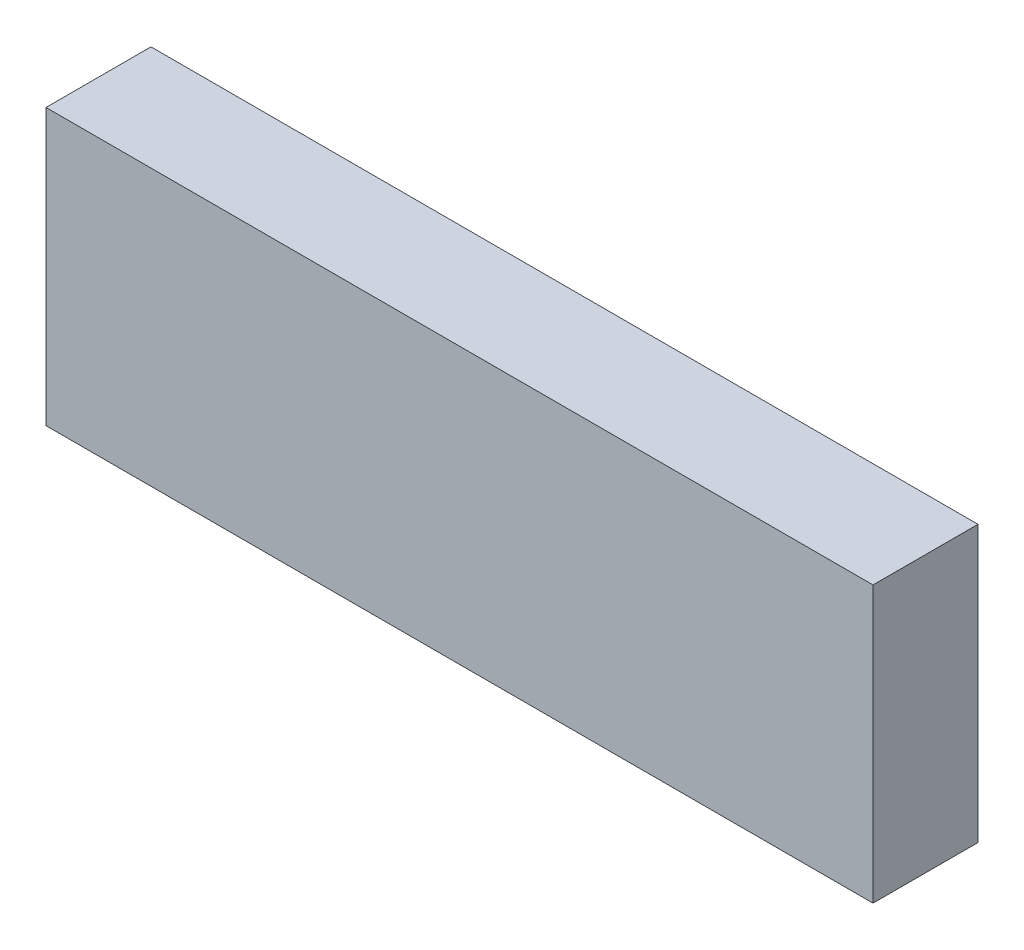
ISO-10303-21;
HEADER;
FILE_DESCRIPTION(('STEP AP214'),'2;1');
FILE_NAME('part.step','',(''),(''),'','','');
FILE_SCHEMA(('AUTOMOTIVE_DESIGN { 1 0 10303 214 1 1 1 1 }'));
ENDSEC;
DATA;
#1=APPLICATION_CONTEXT('core data for automotive mechanical design processes');
#2=APPLICATION_PROTOCOL_DEFINITION('international standard','automotive_design',2000,#1);
#3=PRODUCT_CONTEXT('',#1,'mechanical');
#4=PRODUCT('Part','Part','',(#3));
#5=PRODUCT_RELATED_PRODUCT_CATEGORY('part','',(#4));
#6=PRODUCT_DEFINITION_FORMATION('','',#4);
#7=PRODUCT_DEFINITION_CONTEXT('part definition',#1,'design');
#8=PRODUCT_DEFINITION('design','',#6,#7);
#9=PRODUCT_DEFINITION_SHAPE('','',#8);
#10=(LENGTH_UNIT() NAMED_UNIT(*) SI_UNIT(.MILLI.,.METRE.));
#11=(NAMED_UNIT(*) PLANE_ANGLE_UNIT() SI_UNIT($,.RADIAN.));
#12=(NAMED_UNIT(*) SI_UNIT($,.STERADIAN.) SOLID_ANGLE_UNIT());
#13=UNCERTAINTY_MEASURE_WITH_UNIT(LENGTH_MEASURE(1.E-05),#10,'distance_accuracy_value','');
#14=(GEOMETRIC_REPRESENTATION_CONTEXT(3) GLOBAL_UNCERTAINTY_ASSIGNED_CONTEXT((#13)) GLOBAL_UNIT_ASSIGNED_CONTEXT((#10,
#11,#12)) REPRESENTATION_CONTEXT('',''));
#15=CARTESIAN_POINT('',(0.,0.,0.));
#16=DIRECTION('',(0.,0.,1.));
#17=DIRECTION('',(1.,0.,0.));
#18=AXIS2_PLACEMENT_3D('',#15,#16,#17);
#19=CARTESIAN_POINT('',(0.,30.,0.));
#20=DIRECTION('',(1.,0.,0.));
#21=DIRECTION('',(0.,0.,-1.));
#22=AXIS2_PLACEMENT_3D('',#19,#20,#21);
#23=PLANE('',#22);
#24=DIRECTION('',(0.,0.,1.));
#25=VECTOR('',#24,1.);
#26=CARTESIAN_POINT('',(0.,0.,0.));
#27=LINE('',#26,#25);
#28=CARTESIAN_POINT('',(0.,0.,-11.4283976224775));
#29=VERTEX_POINT('',#28);
#30=CARTESIAN_POINT('',(0.,0.,0.));
#31=VERTEX_POINT('',#30);
#32=EDGE_CURVE('E113',#29,#31,#27,.T.);
#33=ORIENTED_EDGE('',*,*,#32,.T.);
#34=DIRECTION('',(0.,-1.,0.));
#35=VECTOR('',#34,1.);
#36=CARTESIAN_POINT('',(0.,30.,0.));
#37=LINE('',#36,#35);
#38=CARTESIAN_POINT('',(0.,30.,0.));
#39=VERTEX_POINT('',#38);
#40=EDGE_CURVE('E11',#39,#31,#37,.T.);
#41=ORIENTED_EDGE('',*,*,#40,.F.);
#42=DIRECTION('',(0.,0.,1.));
#43=VECTOR('',#42,1.);
#44=CARTESIAN_POINT('',(0.,30.,0.));
#45=LINE('',#44,#43);
#46=CARTESIAN_POINT('',(0.,30.,-11.4283976224775));
#47=VERTEX_POINT('',#46);
#48=EDGE_CURVE('E97',#47,#39,#45,.T.);
#49=ORIENTED_EDGE('',*,*,#48,.F.);
#50=DIRECTION('',(0.,-1.,0.));
#51=VECTOR('',#50,1.);
#52=CARTESIAN_POINT('',(0.,30.,-11.4283976224775));
#53=LINE('',#52,#51);
#54=EDGE_CURVE('E109',#47,#29,#53,.T.);
#55=ORIENTED_EDGE('',*,*,#54,.T.);
#56=EDGE_LOOP('',(#33,#41,#49,#55));
#57=FACE_BOUND('',#56,.T.);
#58=ADVANCED_FACE('F45',(#57),#23,.F.);
#59=CARTESIAN_POINT('',(0.,30.,0.));
#60=DIRECTION('',(0.,0.,-1.));
#61=DIRECTION('',(-1.,0.,0.));
#62=AXIS2_PLACEMENT_3D('',#59,#60,#61);
#63=PLANE('',#62);
#64=DIRECTION('',(1.,0.,0.));
#65=VECTOR('',#64,1.);
#66=CARTESIAN_POINT('',(0.,0.,0.));
#67=LINE('',#66,#65);
#68=CARTESIAN_POINT('',(90.023693552498,0.,0.));
#69=VERTEX_POINT('',#68);
#70=EDGE_CURVE('E102',#31,#69,#67,.T.);
#71=ORIENTED_EDGE('',*,*,#70,.T.);
#72=DIRECTION('',(0.,-1.,0.));
#73=VECTOR('',#72,1.);
#74=CARTESIAN_POINT('',(90.023693552498,30.,0.));
#75=LINE('',#74,#73);
#76=CARTESIAN_POINT('',(90.023693552498,30.,0.));
#77=VERTEX_POINT('',#76);
#78=EDGE_CURVE('E54',#77,#69,#75,.T.);
#79=ORIENTED_EDGE('',*,*,#78,.F.);
#80=DIRECTION('',(1.,0.,0.));
#81=VECTOR('',#80,1.);
#82=CARTESIAN_POINT('',(0.,30.,0.));
#83=LINE('',#82,#81);
#84=EDGE_CURVE('E92',#39,#77,#83,.T.);
#85=ORIENTED_EDGE('',*,*,#84,.F.);
#86=ORIENTED_EDGE('',*,*,#40,.T.);
#87=EDGE_LOOP('',(#71,#79,#85,#86));
#88=FACE_BOUND('',#87,.T.);
#89=ADVANCED_FACE('F101',(#88),#63,.F.);
#90=CARTESIAN_POINT('',(90.023693552498,30.,0.));
#91=DIRECTION('',(-1.,0.,0.));
#92=DIRECTION('',(0.,0.,1.));
#93=AXIS2_PLACEMENT_3D('',#90,#91,#92);
#94=PLANE('',#93);
#95=DIRECTION('',(0.,0.,-1.));
#96=VECTOR('',#95,1.);
#97=CARTESIAN_POINT('',(90.023693552498,0.,0.));
#98=LINE('',#97,#96);
#99=CARTESIAN_POINT('',(90.023693552498,0.,-11.4283976224775));
#100=VERTEX_POINT('',#99);
#101=EDGE_CURVE('E79',#69,#100,#98,.T.);
#102=ORIENTED_EDGE('',*,*,#101,.T.);
#103=DIRECTION('',(0.,-1.,0.));
#104=VECTOR('',#103,1.);
#105=CARTESIAN_POINT('',(90.023693552498,30.,-11.4283976224775));
#106=LINE('',#105,#104);
#107=CARTESIAN_POINT('',(90.023693552498,30.,-11.4283976224775));
#108=VERTEX_POINT('',#107);
#109=EDGE_CURVE('E104',#108,#100,#106,.T.);
#110=ORIENTED_EDGE('',*,*,#109,.F.);
#111=DIRECTION('',(0.,0.,-1.));
#112=VECTOR('',#111,1.);
#113=CARTESIAN_POINT('',(90.023693552498,30.,0.));
#114=LINE('',#113,#112);
#115=EDGE_CURVE('E95',#77,#108,#114,.T.);
#116=ORIENTED_EDGE('',*,*,#115,.F.);
#117=ORIENTED_EDGE('',*,*,#78,.T.);
#118=EDGE_LOOP('',(#102,#110,#116,#117));
#119=FACE_BOUND('',#118,.T.);
#120=ADVANCED_FACE('F105',(#119),#94,.F.);
#121=CARTESIAN_POINT('',(0.,30.,-11.4283976224775));
#122=DIRECTION('',(0.,0.,1.));
#123=DIRECTION('',(1.,0.,0.));
#124=AXIS2_PLACEMENT_3D('',#121,#122,#123);
#125=PLANE('',#124);
#126=DIRECTION('',(-1.,0.,0.));
#127=VECTOR('',#126,1.);
#128=CARTESIAN_POINT('',(0.,0.,-11.4283976224775));
#129=LINE('',#128,#127);
#130=EDGE_CURVE('E85',#100,#29,#129,.T.);
#131=ORIENTED_EDGE('',*,*,#130,.T.);
#132=ORIENTED_EDGE('',*,*,#54,.F.);
#133=DIRECTION('',(-1.,0.,0.));
#134=VECTOR('',#133,1.);
#135=CARTESIAN_POINT('',(0.,30.,-11.4283976224775));
#136=LINE('',#135,#134);
#137=EDGE_CURVE('E62',#108,#47,#136,.T.);
#138=ORIENTED_EDGE('',*,*,#137,.F.);
#139=ORIENTED_EDGE('',*,*,#109,.T.);
#140=EDGE_LOOP('',(#131,#132,#138,#139));
#141=FACE_BOUND('',#140,.T.);
#142=ADVANCED_FACE('F126',(#141),#125,.F.);
#143=CARTESIAN_POINT('',(0.,30.,0.));
#144=DIRECTION('',(0.,-1.,0.));
#145=DIRECTION('',(0.,0.,-1.));
#146=AXIS2_PLACEMENT_3D('',#143,#144,#145);
#147=PLANE('',#146);
#148=ORIENTED_EDGE('',*,*,#48,.T.);
#149=ORIENTED_EDGE('',*,*,#84,.T.);
#150=ORIENTED_EDGE('',*,*,#115,.T.);
#151=ORIENTED_EDGE('',*,*,#137,.T.);
#152=EDGE_LOOP('',(#148,#149,#150,#151));
#153=FACE_BOUND('',#152,.T.);
#154=ADVANCED_FACE('F93',(#153),#147,.F.);
#155=CARTESIAN_POINT('',(0.,0.,0.));
#156=DIRECTION('',(0.,-1.,0.));
#157=DIRECTION('',(0.,0.,-1.));
#158=AXIS2_PLACEMENT_3D('',#155,#156,#157);
#159=PLANE('',#158);
#160=ORIENTED_EDGE('',*,*,#32,.F.);
#161=ORIENTED_EDGE('',*,*,#130,.F.);
#162=ORIENTED_EDGE('',*,*,#101,.F.);
#163=ORIENTED_EDGE('',*,*,#70,.F.);
#164=EDGE_LOOP('',(#160,#161,#162,#163));
#165=FACE_BOUND('',#164,.T.);
#166=ADVANCED_FACE('F129',(#165),#159,.T.);
#167=CLOSED_SHELL('',(#58,#89,#120,#142,#154,#166));
#168=MANIFOLD_SOLID_BREP('B2',#167);
#169=ADVANCED_BREP_SHAPE_REPRESENTATION('',(#18,#168),#14);
#170=SHAPE_DEFINITION_REPRESENTATION(#9,#169);
ENDSEC;
END-ISO-10303-21;
